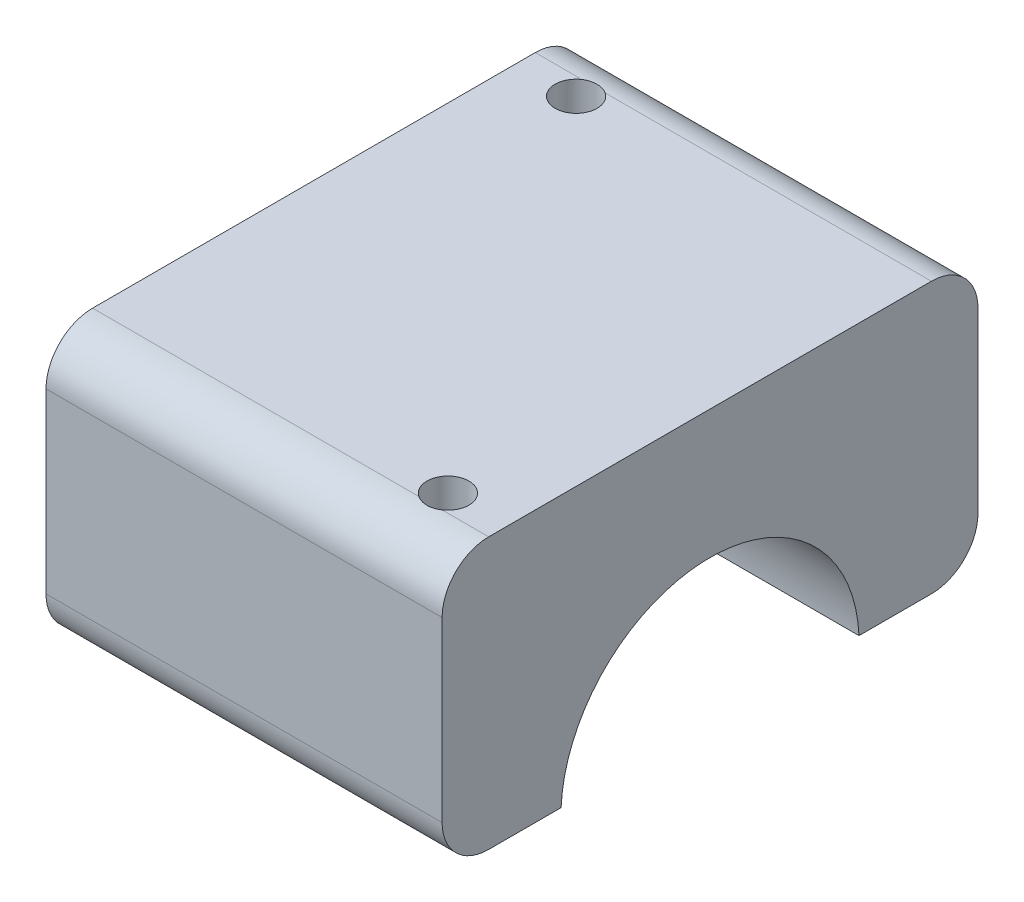
ISO-10303-21;
HEADER;
FILE_DESCRIPTION(('STEP AP214'),'2;1');
FILE_NAME('part.step','',(''),(''),'','','');
FILE_SCHEMA(('AUTOMOTIVE_DESIGN { 1 0 10303 214 1 1 1 1 }'));
ENDSEC;
DATA;
#1=APPLICATION_CONTEXT('core data for automotive mechanical design processes');
#2=APPLICATION_PROTOCOL_DEFINITION('international standard','automotive_design',2000,#1);
#3=PRODUCT_CONTEXT('',#1,'mechanical');
#4=PRODUCT('Part','Part','',(#3));
#5=PRODUCT_RELATED_PRODUCT_CATEGORY('part','',(#4));
#6=PRODUCT_DEFINITION_FORMATION('','',#4);
#7=PRODUCT_DEFINITION_CONTEXT('part definition',#1,'design');
#8=PRODUCT_DEFINITION('design','',#6,#7);
#9=PRODUCT_DEFINITION_SHAPE('','',#8);
#10=(LENGTH_UNIT() NAMED_UNIT(*) SI_UNIT(.MILLI.,.METRE.));
#11=(NAMED_UNIT(*) PLANE_ANGLE_UNIT() SI_UNIT($,.RADIAN.));
#12=(NAMED_UNIT(*) SI_UNIT($,.STERADIAN.) SOLID_ANGLE_UNIT());
#13=UNCERTAINTY_MEASURE_WITH_UNIT(LENGTH_MEASURE(1.E-05),#10,'distance_accuracy_value','');
#14=(GEOMETRIC_REPRESENTATION_CONTEXT(3) GLOBAL_UNCERTAINTY_ASSIGNED_CONTEXT((#13)) GLOBAL_UNIT_ASSIGNED_CONTEXT((#10,
#11,#12)) REPRESENTATION_CONTEXT('',''));
#15=CARTESIAN_POINT('',(0.,0.,0.));
#16=DIRECTION('',(0.,0.,1.));
#17=DIRECTION('',(1.,0.,0.));
#18=AXIS2_PLACEMENT_3D('',#15,#16,#17);
#19=CARTESIAN_POINT('',(17.,4.6,19.));
#20=DIRECTION('',(-1.,0.,0.));
#21=DIRECTION('',(0.,0.,1.));
#22=AXIS2_PLACEMENT_3D('',#19,#20,#21);
#23=CYLINDRICAL_SURFACE('',#22,4.);
#24=CARTESIAN_POINT('',(12.9949874371066,0.6,19.));
#25=CARTESIAN_POINT('',(12.9528080505859,0.600002290201008,19.0279782687762));
#26=CARTESIAN_POINT('',(12.9094699375662,0.600293109258532,19.054162436945));
#27=CARTESIAN_POINT('',(12.8207506643026,0.601246630542694,19.1027880961604));
#28=CARTESIAN_POINT('',(12.775369663094,0.601909303866988,19.1252298779078));
#29=CARTESIAN_POINT('',(12.6367080465194,0.60414515604213,19.1866521635867));
#30=CARTESIAN_POINT('',(12.5407755741953,0.605967454515857,19.2198177956695));
#31=CARTESIAN_POINT('',(12.3447108790185,0.609016111648687,19.2695824039112));
#32=CARTESIAN_POINT('',(12.2445771529861,0.610242254997947,19.2861753969049));
#33=CARTESIAN_POINT('',(12.0429252939834,0.611432977587128,19.3023260095373));
#34=CARTESIAN_POINT('',(11.9414072407699,0.611397629202322,19.3018846064864));
#35=CARTESIAN_POINT('',(11.7400149572337,0.6100843959537,19.2839916011113));
#36=CARTESIAN_POINT('',(11.6401391343925,0.608807797075412,19.266557603754));
#37=CARTESIAN_POINT('',(11.444762981889,0.605710678825216,19.2151942389305));
#38=CARTESIAN_POINT('',(11.3492591599958,0.603890602630139,19.181278297527));
#39=CARTESIAN_POINT('',(11.2134628948282,0.601745422922836,19.1197807652606));
#40=CARTESIAN_POINT('',(11.1703945654969,0.601136078493984,19.0981480345368));
#41=CARTESIAN_POINT('',(11.0862091669758,0.600264553601652,19.0515455180329));
#42=CARTESIAN_POINT('',(11.0450884560688,0.600001698383489,19.0265823227808));
#43=CARTESIAN_POINT('',(11.0050125628934,0.6,19.));
#44=B_SPLINE_CURVE_WITH_KNOTS('',3,(#24,#25,#26,#27,#28,#29,#30,#31,#32,#33,#34,#35,#36,#37,#38,
#39,#40,#41,#42,#43),.UNSPECIFIED.,.F.,.F.,(4,2,2,2,2,2,2,2,2,4),(0.,0.151748564164442,
0.30348533531734,0.606485618853393,0.90959525408197,1.21268749909945,1.51546606256915,
1.81799839737315,1.96246492195647,2.10664969408635),.UNSPECIFIED.);
#45=CARTESIAN_POINT('',(12.9949874371066,0.6,19.));
#46=VERTEX_POINT('',#45);
#47=CARTESIAN_POINT('',(11.0050125628934,0.6,19.));
#48=VERTEX_POINT('',#47);
#49=EDGE_CURVE('E136',#46,#48,#44,.T.);
#50=ORIENTED_EDGE('',*,*,#49,.F.);
#51=DIRECTION('',(-1.,0.,0.));
#52=VECTOR('',#51,1.);
#53=CARTESIAN_POINT('',(17.,0.6,19.));
#54=LINE('',#53,#52);
#55=CARTESIAN_POINT('',(17.,0.6,19.));
#56=VERTEX_POINT('',#55);
#57=EDGE_CURVE('E150',#56,#46,#54,.T.);
#58=ORIENTED_EDGE('',*,*,#57,.F.);
#59=CARTESIAN_POINT('',(17.,4.6,19.));
#60=DIRECTION('',(1.,0.,0.));
#61=DIRECTION('',(0.,0.,-1.));
#62=AXIS2_PLACEMENT_3D('',#59,#60,#61);
#63=CIRCLE('',#62,4.);
#64=CARTESIAN_POINT('',(17.,4.6,23.));
#65=VERTEX_POINT('',#64);
#66=EDGE_CURVE('E333',#65,#56,#63,.T.);
#67=ORIENTED_EDGE('',*,*,#66,.F.);
#68=DIRECTION('',(-1.,0.,0.));
#69=VECTOR('',#68,1.);
#70=CARTESIAN_POINT('',(17.,4.6,23.));
#71=LINE('',#70,#69);
#72=CARTESIAN_POINT('',(-17.,4.6,23.));
#73=VERTEX_POINT('',#72);
#74=EDGE_CURVE('E313',#65,#73,#71,.T.);
#75=ORIENTED_EDGE('',*,*,#74,.T.);
#76=CARTESIAN_POINT('',(-17.,4.6,19.));
#77=DIRECTION('',(1.,0.,0.));
#78=DIRECTION('',(0.,0.,-1.));
#79=AXIS2_PLACEMENT_3D('',#76,#77,#78);
#80=CIRCLE('',#79,4.);
#81=CARTESIAN_POINT('',(-17.,0.6,19.));
#82=VERTEX_POINT('',#81);
#83=EDGE_CURVE('E155',#73,#82,#80,.T.);
#84=ORIENTED_EDGE('',*,*,#83,.T.);
#85=EDGE_CURVE('E148',#48,#82,#54,.T.);
#86=ORIENTED_EDGE('',*,*,#85,.F.);
#87=EDGE_LOOP('',(#50,#58,#67,#75,#84,#86));
#88=FACE_BOUND('',#87,.T.);
#89=ADVANCED_FACE('F39',(#88),#23,.T.);
#90=CARTESIAN_POINT('',(17.,4.6,-19.));
#91=DIRECTION('',(-1.,0.,0.));
#92=DIRECTION('',(0.,0.,1.));
#93=AXIS2_PLACEMENT_3D('',#90,#91,#92);
#94=CYLINDRICAL_SURFACE('',#93,4.);
#95=CARTESIAN_POINT('',(-12.9949874371066,0.6,-19.));
#96=CARTESIAN_POINT('',(-12.9528080505859,0.600002290201008,-19.0279782687762));
#97=CARTESIAN_POINT('',(-12.9094699375662,0.600293109258532,-19.054162436945));
#98=CARTESIAN_POINT('',(-12.8207506643026,0.601246630542694,-19.1027880961604));
#99=CARTESIAN_POINT('',(-12.775369663094,0.601909303866988,-19.1252298779078));
#100=CARTESIAN_POINT('',(-12.6367080465194,0.60414515604213,-19.1866521635867));
#101=CARTESIAN_POINT('',(-12.5407755741953,0.605967454515857,-19.2198177956695));
#102=CARTESIAN_POINT('',(-12.3447108790185,0.609016111648687,-19.2695824039112));
#103=CARTESIAN_POINT('',(-12.2445771529861,0.610242254997947,-19.2861753969049));
#104=CARTESIAN_POINT('',(-12.0429252939834,0.611432977587128,-19.3023260095373));
#105=CARTESIAN_POINT('',(-11.9414072407699,0.611397629202322,-19.3018846064864));
#106=CARTESIAN_POINT('',(-11.7400149572337,0.6100843959537,-19.2839916011113));
#107=CARTESIAN_POINT('',(-11.6401391343925,0.608807797075412,-19.266557603754));
#108=CARTESIAN_POINT('',(-11.444762981889,0.605710678825216,-19.2151942389305));
#109=CARTESIAN_POINT('',(-11.3492591599958,0.603890602630139,-19.181278297527));
#110=CARTESIAN_POINT('',(-11.2134628948282,0.601745422922836,-19.1197807652606));
#111=CARTESIAN_POINT('',(-11.1703945654969,0.601136078493984,-19.0981480345368));
#112=CARTESIAN_POINT('',(-11.0862091669758,0.600264553601652,-19.0515455180329));
#113=CARTESIAN_POINT('',(-11.0450884560688,0.600001698383489,-19.0265823227808));
#114=CARTESIAN_POINT('',(-11.0050125628934,0.6,-19.));
#115=B_SPLINE_CURVE_WITH_KNOTS('',3,(#95,#96,#97,#98,#99,#100,#101,#102,#103,#104,#105,#106,
#107,#108,#109,#110,#111,#112,#113,#114),.UNSPECIFIED.,.F.,.F.,(4,2,2,2,2,2,2,2,2,4),(0.,
0.151748564164442,0.30348533531734,0.606485618853393,0.90959525408197,1.21268749909945,
1.51546606256915,1.81799839737315,1.96246492195647,2.10664969408635),.UNSPECIFIED.);
#116=CARTESIAN_POINT('',(-12.9949874371066,0.6,-19.));
#117=VERTEX_POINT('',#116);
#118=CARTESIAN_POINT('',(-11.0050125628934,0.6,-19.));
#119=VERTEX_POINT('',#118);
#120=EDGE_CURVE('E194',#117,#119,#115,.T.);
#121=ORIENTED_EDGE('',*,*,#120,.F.);
#122=DIRECTION('',(-1.,0.,0.));
#123=VECTOR('',#122,1.);
#124=CARTESIAN_POINT('',(17.,0.6,-19.));
#125=LINE('',#124,#123);
#126=CARTESIAN_POINT('',(-17.,0.6,-19.));
#127=VERTEX_POINT('',#126);
#128=EDGE_CURVE('E159',#117,#127,#125,.T.);
#129=ORIENTED_EDGE('',*,*,#128,.T.);
#130=CARTESIAN_POINT('',(-17.,4.6,-19.));
#131=DIRECTION('',(1.,0.,0.));
#132=DIRECTION('',(0.,0.,-1.));
#133=AXIS2_PLACEMENT_3D('',#130,#131,#132);
#134=CIRCLE('',#133,4.);
#135=CARTESIAN_POINT('',(-17.,4.6,-23.));
#136=VERTEX_POINT('',#135);
#137=EDGE_CURVE('E319',#127,#136,#134,.T.);
#138=ORIENTED_EDGE('',*,*,#137,.T.);
#139=DIRECTION('',(-1.,0.,0.));
#140=VECTOR('',#139,1.);
#141=CARTESIAN_POINT('',(17.,4.6,-23.));
#142=LINE('',#141,#140);
#143=CARTESIAN_POINT('',(17.,4.6,-23.));
#144=VERTEX_POINT('',#143);
#145=EDGE_CURVE('E293',#144,#136,#142,.T.);
#146=ORIENTED_EDGE('',*,*,#145,.F.);
#147=CARTESIAN_POINT('',(17.,4.6,-19.));
#148=DIRECTION('',(1.,0.,0.));
#149=DIRECTION('',(0.,0.,-1.));
#150=AXIS2_PLACEMENT_3D('',#147,#148,#149);
#151=CIRCLE('',#150,4.);
#152=CARTESIAN_POINT('',(17.,0.6,-19.));
#153=VERTEX_POINT('',#152);
#154=EDGE_CURVE('E291',#153,#144,#151,.T.);
#155=ORIENTED_EDGE('',*,*,#154,.F.);
#156=EDGE_CURVE('E156',#153,#119,#125,.T.);
#157=ORIENTED_EDGE('',*,*,#156,.T.);
#158=EDGE_LOOP('',(#121,#129,#138,#146,#155,#157));
#159=FACE_BOUND('',#158,.T.);
#160=ADVANCED_FACE('F205',(#159),#94,.T.);
#161=CARTESIAN_POINT('',(17.,19.84,-19.));
#162=DIRECTION('',(-1.,0.,0.));
#163=DIRECTION('',(0.,0.,1.));
#164=AXIS2_PLACEMENT_3D('',#161,#162,#163);
#165=CYLINDRICAL_SURFACE('',#164,4.);
#166=CARTESIAN_POINT('',(-11.0050125628934,23.84,-19.));
#167=CARTESIAN_POINT('',(-11.0471919494141,23.839997709799,-19.0279782687762));
#168=CARTESIAN_POINT('',(-11.0905300624338,23.8397068907415,-19.054162436945));
#169=CARTESIAN_POINT('',(-11.1792493356974,23.8387533694573,-19.1027880961604));
#170=CARTESIAN_POINT('',(-11.224630336906,23.838090696133,-19.1252298779078));
#171=CARTESIAN_POINT('',(-11.3632919534806,23.8358548439579,-19.1866521635867));
#172=CARTESIAN_POINT('',(-11.4592244258047,23.8340325454841,-19.2198177956695));
#173=CARTESIAN_POINT('',(-11.6552891209815,23.8309838883513,-19.2695824039112));
#174=CARTESIAN_POINT('',(-11.7554228470139,23.8297577450021,-19.2861753969049));
#175=CARTESIAN_POINT('',(-11.9570747060166,23.8285670224129,-19.3023260095373));
#176=CARTESIAN_POINT('',(-12.0585927592301,23.8286023707977,-19.3018846064864));
#177=CARTESIAN_POINT('',(-12.2599850427663,23.8299156040463,-19.2839916011113));
#178=CARTESIAN_POINT('',(-12.3598608656075,23.8311922029246,-19.266557603754));
#179=CARTESIAN_POINT('',(-12.555237018111,23.8342893211748,-19.2151942389305));
#180=CARTESIAN_POINT('',(-12.6507408400042,23.8361093973699,-19.181278297527));
#181=CARTESIAN_POINT('',(-12.7865371051718,23.8382545770772,-19.1197807652606));
#182=CARTESIAN_POINT('',(-12.8296054345031,23.838863921506,-19.0981480345368));
#183=CARTESIAN_POINT('',(-12.9137908330242,23.8397354463984,-19.0515455180329));
#184=CARTESIAN_POINT('',(-12.9549115439312,23.8399983016165,-19.0265823227808));
#185=CARTESIAN_POINT('',(-12.9949874371066,23.84,-19.));
#186=B_SPLINE_CURVE_WITH_KNOTS('',3,(#166,#167,#168,#169,#170,#171,#172,#173,#174,#175,#176,
#177,#178,#179,#180,#181,#182,#183,#184,#185),.UNSPECIFIED.,.F.,.F.,(4,2,2,2,2,2,2,2,2,4),(0.,
0.151748564164442,0.30348533531734,0.606485618853392,0.909595254081968,1.21268749909945,
1.51546606256915,1.81799839737315,1.96246492195647,2.10664969408635),.UNSPECIFIED.);
#187=CARTESIAN_POINT('',(-11.0050125628934,23.84,-19.));
#188=VERTEX_POINT('',#187);
#189=CARTESIAN_POINT('',(-12.9949874371066,23.84,-19.));
#190=VERTEX_POINT('',#189);
#191=EDGE_CURVE('E142',#188,#190,#186,.T.);
#192=ORIENTED_EDGE('',*,*,#191,.F.);
#193=DIRECTION('',(-1.,0.,0.));
#194=VECTOR('',#193,1.);
#195=CARTESIAN_POINT('',(17.,23.84,-19.));
#196=LINE('',#195,#194);
#197=CARTESIAN_POINT('',(17.,23.84,-19.));
#198=VERTEX_POINT('',#197);
#199=EDGE_CURVE('E343',#198,#188,#196,.T.);
#200=ORIENTED_EDGE('',*,*,#199,.F.);
#201=CARTESIAN_POINT('',(17.,19.84,-19.));
#202=DIRECTION('',(1.,0.,0.));
#203=DIRECTION('',(0.,0.,-1.));
#204=AXIS2_PLACEMENT_3D('',#201,#202,#203);
#205=CIRCLE('',#204,4.);
#206=CARTESIAN_POINT('',(17.,19.84,-23.));
#207=VERTEX_POINT('',#206);
#208=EDGE_CURVE('E299',#207,#198,#205,.T.);
#209=ORIENTED_EDGE('',*,*,#208,.F.);
#210=DIRECTION('',(-1.,0.,0.));
#211=VECTOR('',#210,1.);
#212=CARTESIAN_POINT('',(17.,19.84,-23.));
#213=LINE('',#212,#211);
#214=CARTESIAN_POINT('',(-17.,19.84,-23.));
#215=VERTEX_POINT('',#214);
#216=EDGE_CURVE('E346',#207,#215,#213,.T.);
#217=ORIENTED_EDGE('',*,*,#216,.T.);
#218=CARTESIAN_POINT('',(-17.,19.84,-19.));
#219=DIRECTION('',(1.,0.,0.));
#220=DIRECTION('',(0.,0.,-1.));
#221=AXIS2_PLACEMENT_3D('',#218,#219,#220);
#222=CIRCLE('',#221,4.);
#223=CARTESIAN_POINT('',(-17.,23.84,-19.));
#224=VERTEX_POINT('',#223);
#225=EDGE_CURVE('E323',#215,#224,#222,.T.);
#226=ORIENTED_EDGE('',*,*,#225,.T.);
#227=EDGE_CURVE('E342',#190,#224,#196,.T.);
#228=ORIENTED_EDGE('',*,*,#227,.F.);
#229=EDGE_LOOP('',(#192,#200,#209,#217,#226,#228));
#230=FACE_BOUND('',#229,.T.);
#231=ADVANCED_FACE('F201',(#230),#165,.T.);
#232=CARTESIAN_POINT('',(17.,19.84,19.));
#233=DIRECTION('',(-1.,0.,0.));
#234=DIRECTION('',(0.,0.,1.));
#235=AXIS2_PLACEMENT_3D('',#232,#233,#234);
#236=CYLINDRICAL_SURFACE('',#235,4.);
#237=CARTESIAN_POINT('',(11.0050125628934,23.84,19.));
#238=CARTESIAN_POINT('',(11.0471919494141,23.839997709799,19.0279782687762));
#239=CARTESIAN_POINT('',(11.0905300624338,23.8397068907415,19.054162436945));
#240=CARTESIAN_POINT('',(11.1792493356974,23.8387533694573,19.1027880961604));
#241=CARTESIAN_POINT('',(11.224630336906,23.838090696133,19.1252298779078));
#242=CARTESIAN_POINT('',(11.3632919534806,23.8358548439579,19.1866521635867));
#243=CARTESIAN_POINT('',(11.4592244258047,23.8340325454841,19.2198177956695));
#244=CARTESIAN_POINT('',(11.6552891209815,23.8309838883513,19.2695824039112));
#245=CARTESIAN_POINT('',(11.7554228470139,23.8297577450021,19.2861753969049));
#246=CARTESIAN_POINT('',(11.9570747060166,23.8285670224129,19.3023260095373));
#247=CARTESIAN_POINT('',(12.0585927592301,23.8286023707977,19.3018846064864));
#248=CARTESIAN_POINT('',(12.2599850427663,23.8299156040463,19.2839916011113));
#249=CARTESIAN_POINT('',(12.3598608656075,23.8311922029246,19.266557603754));
#250=CARTESIAN_POINT('',(12.555237018111,23.8342893211748,19.2151942389305));
#251=CARTESIAN_POINT('',(12.6507408400042,23.8361093973699,19.181278297527));
#252=CARTESIAN_POINT('',(12.7865371051718,23.8382545770772,19.1197807652606));
#253=CARTESIAN_POINT('',(12.8296054345031,23.838863921506,19.0981480345368));
#254=CARTESIAN_POINT('',(12.9137908330242,23.8397354463984,19.0515455180329));
#255=CARTESIAN_POINT('',(12.9549115439312,23.8399983016165,19.0265823227808));
#256=CARTESIAN_POINT('',(12.9949874371066,23.84,19.));
#257=B_SPLINE_CURVE_WITH_KNOTS('',3,(#237,#238,#239,#240,#241,#242,#243,#244,#245,#246,#247,
#248,#249,#250,#251,#252,#253,#254,#255,#256),.UNSPECIFIED.,.F.,.F.,(4,2,2,2,2,2,2,2,2,4),(0.,
0.151748564164442,0.30348533531734,0.606485618853392,0.909595254081968,1.21268749909945,
1.51546606256915,1.81799839737315,1.96246492195647,2.10664969408635),.UNSPECIFIED.);
#258=CARTESIAN_POINT('',(11.0050125628934,23.84,19.));
#259=VERTEX_POINT('',#258);
#260=CARTESIAN_POINT('',(12.9949874371066,23.84,19.));
#261=VERTEX_POINT('',#260);
#262=EDGE_CURVE('E47',#259,#261,#257,.T.);
#263=ORIENTED_EDGE('',*,*,#262,.F.);
#264=DIRECTION('',(-1.,0.,0.));
#265=VECTOR('',#264,1.);
#266=CARTESIAN_POINT('',(17.,23.84,19.));
#267=LINE('',#266,#265);
#268=CARTESIAN_POINT('',(-17.,23.84,19.));
#269=VERTEX_POINT('',#268);
#270=EDGE_CURVE('E338',#259,#269,#267,.T.);
#271=ORIENTED_EDGE('',*,*,#270,.T.);
#272=CARTESIAN_POINT('',(-17.,19.84,19.));
#273=DIRECTION('',(1.,0.,0.));
#274=DIRECTION('',(0.,0.,-1.));
#275=AXIS2_PLACEMENT_3D('',#272,#273,#274);
#276=CIRCLE('',#275,4.);
#277=CARTESIAN_POINT('',(-17.,19.84,23.));
#278=VERTEX_POINT('',#277);
#279=EDGE_CURVE('E329',#269,#278,#276,.T.);
#280=ORIENTED_EDGE('',*,*,#279,.T.);
#281=DIRECTION('',(-1.,0.,0.));
#282=VECTOR('',#281,1.);
#283=CARTESIAN_POINT('',(17.,19.84,23.));
#284=LINE('',#283,#282);
#285=CARTESIAN_POINT('',(17.,19.84,23.));
#286=VERTEX_POINT('',#285);
#287=EDGE_CURVE('E335',#286,#278,#284,.T.);
#288=ORIENTED_EDGE('',*,*,#287,.F.);
#289=CARTESIAN_POINT('',(17.,19.84,19.));
#290=DIRECTION('',(1.,0.,0.));
#291=DIRECTION('',(0.,0.,-1.));
#292=AXIS2_PLACEMENT_3D('',#289,#290,#291);
#293=CIRCLE('',#292,4.);
#294=CARTESIAN_POINT('',(17.,23.84,19.));
#295=VERTEX_POINT('',#294);
#296=EDGE_CURVE('E309',#295,#286,#293,.T.);
#297=ORIENTED_EDGE('',*,*,#296,.F.);
#298=EDGE_CURVE('E339',#295,#261,#267,.T.);
#299=ORIENTED_EDGE('',*,*,#298,.T.);
#300=EDGE_LOOP('',(#263,#271,#280,#288,#297,#299));
#301=FACE_BOUND('',#300,.T.);
#302=ADVANCED_FACE('F168',(#301),#236,.T.);
#303=CARTESIAN_POINT('',(17.,0.6,19.));
#304=DIRECTION('',(0.,1.,0.));
#305=DIRECTION('',(0.,0.,1.));
#306=AXIS2_PLACEMENT_3D('',#303,#304,#305);
#307=PLANE('',#306);
#308=CARTESIAN_POINT('',(12.,0.6,17.5));
#309=DIRECTION('',(0.,1.,0.));
#310=DIRECTION('',(0.,0.,1.));
#311=AXIS2_PLACEMENT_3D('',#308,#309,#310);
#312=CIRCLE('',#311,1.8);
#313=EDGE_CURVE('E53',#46,#48,#312,.T.);
#314=ORIENTED_EDGE('',*,*,#313,.T.);
#315=ORIENTED_EDGE('',*,*,#85,.T.);
#316=DIRECTION('',(0.,0.,-1.));
#317=VECTOR('',#316,1.);
#318=CARTESIAN_POINT('',(-17.,0.6,19.));
#319=LINE('',#318,#317);
#320=CARTESIAN_POINT('',(-17.,0.6,12.7859297667397));
#321=VERTEX_POINT('',#320);
#322=EDGE_CURVE('E317',#82,#321,#319,.T.);
#323=ORIENTED_EDGE('',*,*,#322,.T.);
#324=DIRECTION('',(1.,0.,0.));
#325=VECTOR('',#324,1.);
#326=CARTESIAN_POINT('',(-17.,0.6,12.7859297667397));
#327=LINE('',#326,#325);
#328=CARTESIAN_POINT('',(17.,0.6,12.7859297667397));
#329=VERTEX_POINT('',#328);
#330=EDGE_CURVE('E316',#321,#329,#327,.T.);
#331=ORIENTED_EDGE('',*,*,#330,.T.);
#332=DIRECTION('',(0.,0.,-1.));
#333=VECTOR('',#332,1.);
#334=CARTESIAN_POINT('',(17.,0.6,19.));
#335=LINE('',#334,#333);
#336=EDGE_CURVE('E297',#56,#329,#335,.T.);
#337=ORIENTED_EDGE('',*,*,#336,.F.);
#338=ORIENTED_EDGE('',*,*,#57,.T.);
#339=EDGE_LOOP('',(#314,#315,#323,#331,#337,#338));
#340=FACE_BOUND('',#339,.T.);
#341=ADVANCED_FACE('F146',(#340),#307,.F.);
#342=CARTESIAN_POINT('',(-12.,0.6,-17.5));
#343=DIRECTION('',(0.,1.,0.));
#344=DIRECTION('',(0.,0.,1.));
#345=AXIS2_PLACEMENT_3D('',#342,#343,#344);
#346=CIRCLE('',#345,1.8);
#347=EDGE_CURVE('E60',#117,#119,#346,.T.);
#348=ORIENTED_EDGE('',*,*,#347,.T.);
#349=ORIENTED_EDGE('',*,*,#156,.F.);
#350=CARTESIAN_POINT('',(17.,0.6,-12.7859297667397));
#351=VERTEX_POINT('',#350);
#352=EDGE_CURVE('E302',#351,#153,#335,.T.);
#353=ORIENTED_EDGE('',*,*,#352,.F.);
#354=DIRECTION('',(1.,0.,0.));
#355=VECTOR('',#354,1.);
#356=CARTESIAN_POINT('',(-17.,0.6,-12.7859297667397));
#357=LINE('',#356,#355);
#358=CARTESIAN_POINT('',(-17.,0.6,-12.7859297667397));
#359=VERTEX_POINT('',#358);
#360=EDGE_CURVE('E352',#351,#359,#357,.F.);
#361=ORIENTED_EDGE('',*,*,#360,.T.);
#362=EDGE_CURVE('E315',#359,#127,#319,.T.);
#363=ORIENTED_EDGE('',*,*,#362,.T.);
#364=ORIENTED_EDGE('',*,*,#128,.F.);
#365=EDGE_LOOP('',(#348,#349,#353,#361,#363,#364));
#366=FACE_BOUND('',#365,.T.);
#367=ADVANCED_FACE('F210',(#366),#307,.F.);
#368=CARTESIAN_POINT('',(17.,4.6,-23.));
#369=DIRECTION('',(0.,0.,1.));
#370=DIRECTION('',(1.,0.,0.));
#371=AXIS2_PLACEMENT_3D('',#368,#369,#370);
#372=PLANE('',#371);
#373=DIRECTION('',(0.,1.,0.));
#374=VECTOR('',#373,1.);
#375=CARTESIAN_POINT('',(-17.,4.6,-23.));
#376=LINE('',#375,#374);
#377=EDGE_CURVE('E321',#136,#215,#376,.T.);
#378=ORIENTED_EDGE('',*,*,#377,.T.);
#379=ORIENTED_EDGE('',*,*,#216,.F.);
#380=DIRECTION('',(0.,1.,0.));
#381=VECTOR('',#380,1.);
#382=CARTESIAN_POINT('',(17.,4.6,-23.));
#383=LINE('',#382,#381);
#384=EDGE_CURVE('E296',#144,#207,#383,.T.);
#385=ORIENTED_EDGE('',*,*,#384,.F.);
#386=ORIENTED_EDGE('',*,*,#145,.T.);
#387=EDGE_LOOP('',(#378,#379,#385,#386));
#388=FACE_BOUND('',#387,.T.);
#389=ADVANCED_FACE('F208',(#388),#372,.F.);
#390=CARTESIAN_POINT('',(17.,23.84,-19.));
#391=DIRECTION('',(0.,-1.,0.));
#392=DIRECTION('',(0.,0.,-1.));
#393=AXIS2_PLACEMENT_3D('',#390,#391,#392);
#394=PLANE('',#393);
#395=CARTESIAN_POINT('',(12.,23.84,17.5));
#396=DIRECTION('',(0.,-1.,0.));
#397=DIRECTION('',(0.,0.,-1.));
#398=AXIS2_PLACEMENT_3D('',#395,#396,#397);
#399=CIRCLE('',#398,1.8);
#400=EDGE_CURVE('E143',#261,#259,#399,.F.);
#401=ORIENTED_EDGE('',*,*,#400,.F.);
#402=ORIENTED_EDGE('',*,*,#298,.F.);
#403=DIRECTION('',(0.,0.,1.));
#404=VECTOR('',#403,1.);
#405=CARTESIAN_POINT('',(17.,23.84,-19.));
#406=LINE('',#405,#404);
#407=EDGE_CURVE('E307',#198,#295,#406,.T.);
#408=ORIENTED_EDGE('',*,*,#407,.F.);
#409=ORIENTED_EDGE('',*,*,#199,.T.);
#410=CARTESIAN_POINT('',(-12.,23.84,-17.5));
#411=DIRECTION('',(0.,-1.,0.));
#412=DIRECTION('',(0.,0.,-1.));
#413=AXIS2_PLACEMENT_3D('',#410,#411,#412);
#414=CIRCLE('',#413,1.8);
#415=EDGE_CURVE('E11',#190,#188,#414,.F.);
#416=ORIENTED_EDGE('',*,*,#415,.F.);
#417=ORIENTED_EDGE('',*,*,#227,.T.);
#418=DIRECTION('',(0.,0.,1.));
#419=VECTOR('',#418,1.);
#420=CARTESIAN_POINT('',(-17.,23.84,-19.));
#421=LINE('',#420,#419);
#422=EDGE_CURVE('E326',#224,#269,#421,.T.);
#423=ORIENTED_EDGE('',*,*,#422,.T.);
#424=ORIENTED_EDGE('',*,*,#270,.F.);
#425=EDGE_LOOP('',(#401,#402,#408,#409,#416,#417,#423,#424));
#426=FACE_BOUND('',#425,.T.);
#427=ADVANCED_FACE('F207',(#426),#394,.F.);
#428=CARTESIAN_POINT('',(17.,19.84,23.));
#429=DIRECTION('',(0.,0.,-1.));
#430=DIRECTION('',(-1.,0.,0.));
#431=AXIS2_PLACEMENT_3D('',#428,#429,#430);
#432=PLANE('',#431);
#433=DIRECTION('',(0.,-1.,0.));
#434=VECTOR('',#433,1.);
#435=CARTESIAN_POINT('',(-17.,19.84,23.));
#436=LINE('',#435,#434);
#437=EDGE_CURVE('E331',#278,#73,#436,.T.);
#438=ORIENTED_EDGE('',*,*,#437,.T.);
#439=ORIENTED_EDGE('',*,*,#74,.F.);
#440=DIRECTION('',(0.,-1.,0.));
#441=VECTOR('',#440,1.);
#442=CARTESIAN_POINT('',(17.,19.84,23.));
#443=LINE('',#442,#441);
#444=EDGE_CURVE('E311',#286,#65,#443,.T.);
#445=ORIENTED_EDGE('',*,*,#444,.F.);
#446=ORIENTED_EDGE('',*,*,#287,.T.);
#447=EDGE_LOOP('',(#438,#439,#445,#446));
#448=FACE_BOUND('',#447,.T.);
#449=ADVANCED_FACE('F376',(#448),#432,.F.);
#450=CARTESIAN_POINT('',(17.,4.6,19.));
#451=DIRECTION('',(1.,0.,0.));
#452=DIRECTION('',(0.,0.,-1.));
#453=AXIS2_PLACEMENT_3D('',#450,#451,#452);
#454=PLANE('',#453);
#455=CARTESIAN_POINT('',(17.,0.,0.));
#456=DIRECTION('',(1.,0.,0.));
#457=DIRECTION('',(0.,0.,-1.));
#458=AXIS2_PLACEMENT_3D('',#455,#456,#457);
#459=CIRCLE('',#458,12.8);
#460=EDGE_CURVE('E285',#351,#329,#459,.T.);
#461=ORIENTED_EDGE('',*,*,#460,.F.);
#462=ORIENTED_EDGE('',*,*,#352,.T.);
#463=ORIENTED_EDGE('',*,*,#154,.T.);
#464=ORIENTED_EDGE('',*,*,#384,.T.);
#465=ORIENTED_EDGE('',*,*,#208,.T.);
#466=ORIENTED_EDGE('',*,*,#407,.T.);
#467=ORIENTED_EDGE('',*,*,#296,.T.);
#468=ORIENTED_EDGE('',*,*,#444,.T.);
#469=ORIENTED_EDGE('',*,*,#66,.T.);
#470=ORIENTED_EDGE('',*,*,#336,.T.);
#471=EDGE_LOOP('',(#461,#462,#463,#464,#465,#466,#467,#468,#469,#470));
#472=FACE_BOUND('',#471,.T.);
#473=ADVANCED_FACE('F363',(#472),#454,.T.);
#474=CARTESIAN_POINT('',(-17.,4.6,19.));
#475=DIRECTION('',(1.,0.,0.));
#476=DIRECTION('',(0.,0.,-1.));
#477=AXIS2_PLACEMENT_3D('',#474,#475,#476);
#478=PLANE('',#477);
#479=ORIENTED_EDGE('',*,*,#362,.F.);
#480=CARTESIAN_POINT('',(-17.,0.,0.));
#481=DIRECTION('',(1.,0.,0.));
#482=DIRECTION('',(0.,0.,-1.));
#483=AXIS2_PLACEMENT_3D('',#480,#481,#482);
#484=CIRCLE('',#483,12.8);
#485=EDGE_CURVE('E383',#359,#321,#484,.T.);
#486=ORIENTED_EDGE('',*,*,#485,.T.);
#487=ORIENTED_EDGE('',*,*,#322,.F.);
#488=ORIENTED_EDGE('',*,*,#83,.F.);
#489=ORIENTED_EDGE('',*,*,#437,.F.);
#490=ORIENTED_EDGE('',*,*,#279,.F.);
#491=ORIENTED_EDGE('',*,*,#422,.F.);
#492=ORIENTED_EDGE('',*,*,#225,.F.);
#493=ORIENTED_EDGE('',*,*,#377,.F.);
#494=ORIENTED_EDGE('',*,*,#137,.F.);
#495=EDGE_LOOP('',(#479,#486,#487,#488,#489,#490,#491,#492,#493,#494));
#496=FACE_BOUND('',#495,.T.);
#497=ADVANCED_FACE('F254',(#496),#478,.F.);
#498=CARTESIAN_POINT('',(-17.,0.,0.));
#499=DIRECTION('',(1.,0.,0.));
#500=DIRECTION('',(0.,0.,-1.));
#501=AXIS2_PLACEMENT_3D('',#498,#499,#500);
#502=CYLINDRICAL_SURFACE('',#501,12.8);
#503=ORIENTED_EDGE('',*,*,#485,.F.);
#504=ORIENTED_EDGE('',*,*,#360,.F.);
#505=ORIENTED_EDGE('',*,*,#460,.T.);
#506=ORIENTED_EDGE('',*,*,#330,.F.);
#507=EDGE_LOOP('',(#503,#504,#505,#506));
#508=FACE_BOUND('',#507,.T.);
#509=ADVANCED_FACE('F176',(#508),#502,.F.);
#510=CARTESIAN_POINT('',(12.,24.44,17.5));
#511=DIRECTION('',(0.,-1.,0.));
#512=DIRECTION('',(0.,0.,-1.));
#513=AXIS2_PLACEMENT_3D('',#510,#511,#512);
#514=CYLINDRICAL_SURFACE('',#513,1.8);
#515=ORIENTED_EDGE('',*,*,#400,.T.);
#516=ORIENTED_EDGE('',*,*,#262,.T.);
#517=EDGE_LOOP('',(#515,#516));
#518=FACE_BOUND('',#517,.T.);
#519=ORIENTED_EDGE('',*,*,#49,.T.);
#520=ORIENTED_EDGE('',*,*,#313,.F.);
#521=EDGE_LOOP('',(#519,#520));
#522=FACE_BOUND('',#521,.T.);
#523=ADVANCED_FACE('F137',(#518,#522),#514,.F.);
#524=CARTESIAN_POINT('',(-12.,24.44,-17.5));
#525=DIRECTION('',(0.,-1.,0.));
#526=DIRECTION('',(0.,0.,-1.));
#527=AXIS2_PLACEMENT_3D('',#524,#525,#526);
#528=CYLINDRICAL_SURFACE('',#527,1.8);
#529=ORIENTED_EDGE('',*,*,#191,.T.);
#530=ORIENTED_EDGE('',*,*,#415,.T.);
#531=EDGE_LOOP('',(#529,#530));
#532=FACE_BOUND('',#531,.T.);
#533=ORIENTED_EDGE('',*,*,#120,.T.);
#534=ORIENTED_EDGE('',*,*,#347,.F.);
#535=EDGE_LOOP('',(#533,#534));
#536=FACE_BOUND('',#535,.T.);
#537=ADVANCED_FACE('F175',(#532,#536),#528,.F.);
#538=CLOSED_SHELL('',(#89,#160,#231,#302,#341,#367,#389,#427,#449,#473,#497,#509,#523,#537));
#539=MANIFOLD_SOLID_BREP('B2',#538);
#540=ADVANCED_BREP_SHAPE_REPRESENTATION('',(#18,#539),#14);
#541=SHAPE_DEFINITION_REPRESENTATION(#9,#540);
ENDSEC;
END-ISO-10303-21;
